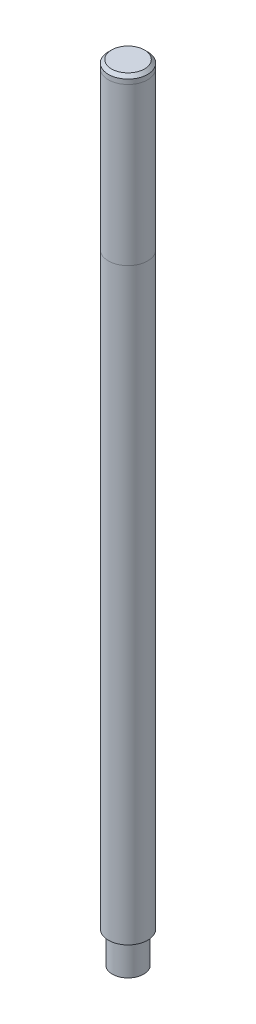
ISO-10303-21;
HEADER;
FILE_DESCRIPTION(('STEP AP214'),'2;1');
FILE_NAME('part.step','',(''),(''),'','','');
FILE_SCHEMA(('AUTOMOTIVE_DESIGN { 1 0 10303 214 1 1 1 1 }'));
ENDSEC;
DATA;
#1=APPLICATION_CONTEXT('core data for automotive mechanical design processes');
#2=APPLICATION_PROTOCOL_DEFINITION('international standard','automotive_design',2000,#1);
#3=PRODUCT_CONTEXT('',#1,'mechanical');
#4=PRODUCT('Part','Part','',(#3));
#5=PRODUCT_RELATED_PRODUCT_CATEGORY('part','',(#4));
#6=PRODUCT_DEFINITION_FORMATION('','',#4);
#7=PRODUCT_DEFINITION_CONTEXT('part definition',#1,'design');
#8=PRODUCT_DEFINITION('design','',#6,#7);
#9=PRODUCT_DEFINITION_SHAPE('','',#8);
#10=(LENGTH_UNIT() NAMED_UNIT(*) SI_UNIT(.MILLI.,.METRE.));
#11=(NAMED_UNIT(*) PLANE_ANGLE_UNIT() SI_UNIT($,.RADIAN.));
#12=(NAMED_UNIT(*) SI_UNIT($,.STERADIAN.) SOLID_ANGLE_UNIT());
#13=UNCERTAINTY_MEASURE_WITH_UNIT(LENGTH_MEASURE(1.E-05),#10,'distance_accuracy_value','');
#14=(GEOMETRIC_REPRESENTATION_CONTEXT(3) GLOBAL_UNCERTAINTY_ASSIGNED_CONTEXT((#13)) GLOBAL_UNIT_ASSIGNED_CONTEXT((#10,
#11,#12)) REPRESENTATION_CONTEXT('',''));
#15=CARTESIAN_POINT('',(0.,0.,0.));
#16=DIRECTION('',(0.,0.,1.));
#17=DIRECTION('',(1.,0.,0.));
#18=AXIS2_PLACEMENT_3D('',#15,#16,#17);
#19=CARTESIAN_POINT('',(0.,250.,0.));
#20=DIRECTION('',(0.,-1.,0.));
#21=DIRECTION('',(0.,0.,-1.));
#22=AXIS2_PLACEMENT_3D('',#19,#20,#21);
#23=CYLINDRICAL_SURFACE('',#22,12.5);
#24=CARTESIAN_POINT('',(0.,145.,0.));
#25=DIRECTION('',(0.,1.,0.));
#26=DIRECTION('',(0.,0.,1.));
#27=AXIS2_PLACEMENT_3D('',#24,#25,#26);
#28=CIRCLE('',#27,12.5);
#29=CARTESIAN_POINT('',(0.,145.,12.5));
#30=VERTEX_POINT('',#29);
#31=EDGE_CURVE('E63',#30,#30,#28,.T.);
#32=ORIENTED_EDGE('',*,*,#31,.F.);
#33=EDGE_LOOP('',(#32));
#34=FACE_BOUND('',#33,.T.);
#35=CARTESIAN_POINT('',(0.,-230.,0.));
#36=DIRECTION('',(0.,-1.,0.));
#37=DIRECTION('',(0.,0.,-1.));
#38=AXIS2_PLACEMENT_3D('',#35,#36,#37);
#39=CIRCLE('',#38,12.5);
#40=CARTESIAN_POINT('',(0.,-230.,-12.5));
#41=VERTEX_POINT('',#40);
#42=EDGE_CURVE('E69',#41,#41,#39,.T.);
#43=ORIENTED_EDGE('',*,*,#42,.F.);
#44=EDGE_LOOP('',(#43));
#45=FACE_BOUND('',#44,.T.);
#46=ADVANCED_FACE('F47',(#34,#45),#23,.T.);
#47=CARTESIAN_POINT('',(0.,248.,0.));
#48=DIRECTION('',(0.,1.,0.));
#49=DIRECTION('',(0.,0.,1.));
#50=AXIS2_PLACEMENT_3D('',#47,#48,#49);
#51=CIRCLE('',#50,12.5);
#52=CARTESIAN_POINT('',(0.,248.,12.5));
#53=VERTEX_POINT('',#52);
#54=EDGE_CURVE('E10',#53,#53,#51,.F.);
#55=ORIENTED_EDGE('',*,*,#54,.T.);
#56=EDGE_LOOP('',(#55));
#57=FACE_BOUND('',#56,.T.);
#58=CARTESIAN_POINT('',(0.,245.,0.));
#59=DIRECTION('',(0.,-1.,0.));
#60=DIRECTION('',(0.,0.,-1.));
#61=AXIS2_PLACEMENT_3D('',#58,#59,#60);
#62=CIRCLE('',#61,12.5);
#63=CARTESIAN_POINT('',(0.,245.,-12.5));
#64=VERTEX_POINT('',#63);
#65=EDGE_CURVE('E58',#64,#64,#62,.T.);
#66=ORIENTED_EDGE('',*,*,#65,.F.);
#67=EDGE_LOOP('',(#66));
#68=FACE_BOUND('',#67,.T.);
#69=ADVANCED_FACE('F89',(#57,#68),#23,.T.);
#70=ORIENTED_EDGE('',*,*,#65,.T.);
#71=EDGE_LOOP('',(#70));
#72=FACE_BOUND('',#71,.T.);
#73=ORIENTED_EDGE('',*,*,#31,.T.);
#74=EDGE_LOOP('',(#73));
#75=FACE_BOUND('',#74,.T.);
#76=ADVANCED_FACE('F91',(#72,#75),#23,.T.);
#77=CARTESIAN_POINT('',(0.,250.,0.));
#78=DIRECTION('',(0.,1.,0.));
#79=DIRECTION('',(0.,0.,1.));
#80=AXIS2_PLACEMENT_3D('',#77,#78,#79);
#81=PLANE('',#80);
#82=CARTESIAN_POINT('',(0.,250.,0.));
#83=DIRECTION('',(0.,1.,0.));
#84=DIRECTION('',(0.,0.,1.));
#85=AXIS2_PLACEMENT_3D('',#82,#83,#84);
#86=CIRCLE('',#85,10.5000000000002);
#87=CARTESIAN_POINT('',(0.,250.,10.5000000000002));
#88=VERTEX_POINT('',#87);
#89=EDGE_CURVE('E54',#88,#88,#86,.T.);
#90=ORIENTED_EDGE('',*,*,#89,.T.);
#91=EDGE_LOOP('',(#90));
#92=FACE_BOUND('',#91,.T.);
#93=ADVANCED_FACE('F99',(#92),#81,.T.);
#94=CARTESIAN_POINT('',(0.,250.,0.));
#95=DIRECTION('',(0.,-1.,0.));
#96=DIRECTION('',(0.,0.,-1.));
#97=AXIS2_PLACEMENT_3D('',#94,#95,#96);
#98=CONICAL_SURFACE('',#97,10.5000000000002,0.785398163397425);
#99=ORIENTED_EDGE('',*,*,#54,.F.);
#100=EDGE_LOOP('',(#99));
#101=FACE_BOUND('',#100,.T.);
#102=ORIENTED_EDGE('',*,*,#89,.F.);
#103=EDGE_LOOP('',(#102));
#104=FACE_BOUND('',#103,.T.);
#105=ADVANCED_FACE('F49',(#101,#104),#98,.T.);
#106=CARTESIAN_POINT('',(0.,-230.,0.));
#107=DIRECTION('',(0.,-1.,0.));
#108=DIRECTION('',(0.,0.,-1.));
#109=AXIS2_PLACEMENT_3D('',#106,#107,#108);
#110=PLANE('',#109);
#111=CARTESIAN_POINT('',(0.,-230.,0.));
#112=DIRECTION('',(0.,-1.,0.));
#113=DIRECTION('',(0.,0.,-1.));
#114=AXIS2_PLACEMENT_3D('',#111,#112,#113);
#115=CIRCLE('',#114,10.);
#116=CARTESIAN_POINT('',(0.,-230.,-10.));
#117=VERTEX_POINT('',#116);
#118=EDGE_CURVE('E72',#117,#117,#115,.T.);
#119=ORIENTED_EDGE('',*,*,#118,.F.);
#120=EDGE_LOOP('',(#119));
#121=FACE_BOUND('',#120,.T.);
#122=ORIENTED_EDGE('',*,*,#42,.T.);
#123=EDGE_LOOP('',(#122));
#124=FACE_BOUND('',#123,.T.);
#125=ADVANCED_FACE('F82',(#121,#124),#110,.T.);
#126=CARTESIAN_POINT('',(0.,-230.,0.));
#127=DIRECTION('',(0.,-1.,0.));
#128=DIRECTION('',(0.,0.,-1.));
#129=AXIS2_PLACEMENT_3D('',#126,#127,#128);
#130=CYLINDRICAL_SURFACE('',#129,10.);
#131=ORIENTED_EDGE('',*,*,#118,.T.);
#132=EDGE_LOOP('',(#131));
#133=FACE_BOUND('',#132,.T.);
#134=CARTESIAN_POINT('',(0.,-250.,0.));
#135=DIRECTION('',(0.,-1.,0.));
#136=DIRECTION('',(0.,0.,-1.));
#137=AXIS2_PLACEMENT_3D('',#134,#135,#136);
#138=CIRCLE('',#137,10.);
#139=CARTESIAN_POINT('',(0.,-250.,-10.));
#140=VERTEX_POINT('',#139);
#141=EDGE_CURVE('E73',#140,#140,#138,.T.);
#142=ORIENTED_EDGE('',*,*,#141,.F.);
#143=EDGE_LOOP('',(#142));
#144=FACE_BOUND('',#143,.T.);
#145=ADVANCED_FACE('F79',(#133,#144),#130,.T.);
#146=CARTESIAN_POINT('',(0.,-250.,0.));
#147=DIRECTION('',(0.,1.,0.));
#148=DIRECTION('',(0.,0.,1.));
#149=AXIS2_PLACEMENT_3D('',#146,#147,#148);
#150=PLANE('',#149);
#151=ORIENTED_EDGE('',*,*,#141,.T.);
#152=EDGE_LOOP('',(#151));
#153=FACE_BOUND('',#152,.T.);
#154=ADVANCED_FACE('F112',(#153),#150,.F.);
#155=CLOSED_SHELL('',(#46,#69,#76,#93,#105,#125,#145,#154));
#156=MANIFOLD_SOLID_BREP('B2',#155);
#157=ADVANCED_BREP_SHAPE_REPRESENTATION('',(#18,#156),#14);
#158=SHAPE_DEFINITION_REPRESENTATION(#9,#157);
ENDSEC;
END-ISO-10303-21;
